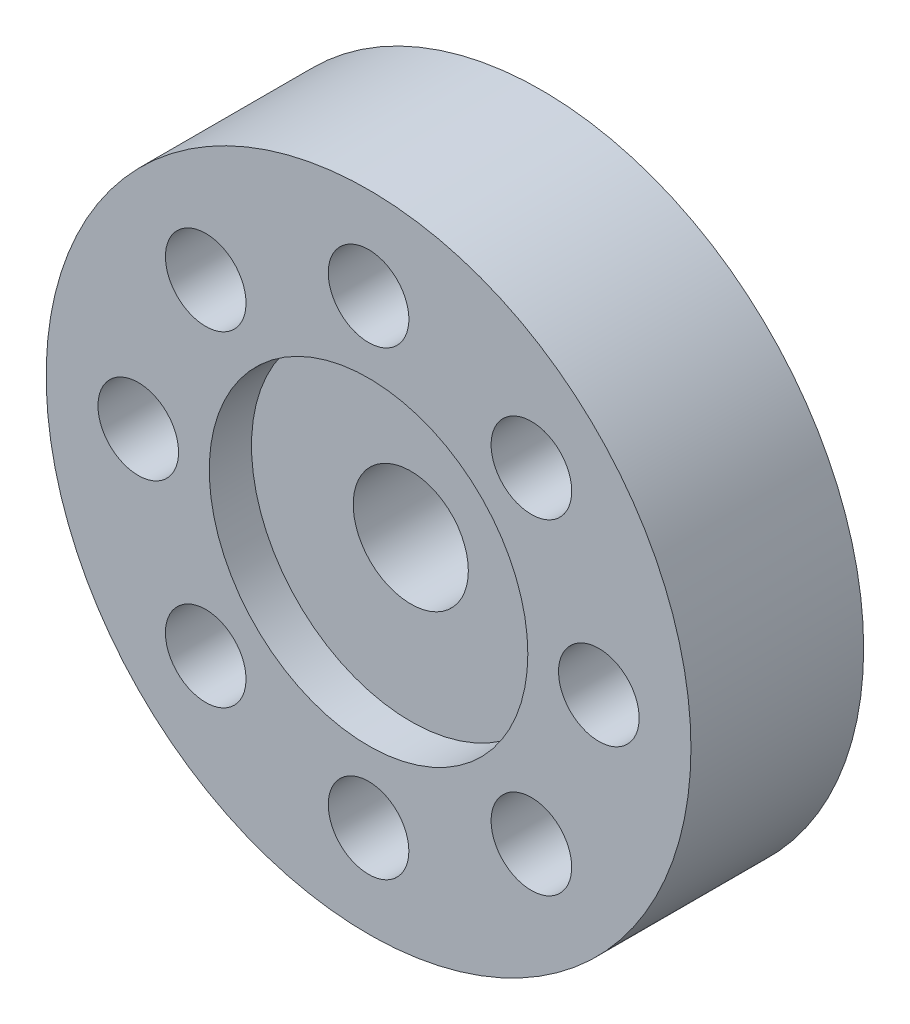
ISO-10303-21;
HEADER;
FILE_DESCRIPTION(('STEP AP214'),'2;1');
FILE_NAME('part.step','',(''),(''),'','','');
FILE_SCHEMA(('AUTOMOTIVE_DESIGN { 1 0 10303 214 1 1 1 1 }'));
ENDSEC;
DATA;
#1=APPLICATION_CONTEXT('core data for automotive mechanical design processes');
#2=APPLICATION_PROTOCOL_DEFINITION('international standard','automotive_design',2000,#1);
#3=PRODUCT_CONTEXT('',#1,'mechanical');
#4=PRODUCT('Part','Part','',(#3));
#5=PRODUCT_RELATED_PRODUCT_CATEGORY('part','',(#4));
#6=PRODUCT_DEFINITION_FORMATION('','',#4);
#7=PRODUCT_DEFINITION_CONTEXT('part definition',#1,'design');
#8=PRODUCT_DEFINITION('design','',#6,#7);
#9=PRODUCT_DEFINITION_SHAPE('','',#8);
#10=(LENGTH_UNIT() NAMED_UNIT(*) SI_UNIT(.MILLI.,.METRE.));
#11=(NAMED_UNIT(*) PLANE_ANGLE_UNIT() SI_UNIT($,.RADIAN.));
#12=(NAMED_UNIT(*) SI_UNIT($,.STERADIAN.) SOLID_ANGLE_UNIT());
#13=UNCERTAINTY_MEASURE_WITH_UNIT(LENGTH_MEASURE(1.E-05),#10,'distance_accuracy_value','');
#14=(GEOMETRIC_REPRESENTATION_CONTEXT(3) GLOBAL_UNCERTAINTY_ASSIGNED_CONTEXT((#13)) GLOBAL_UNIT_ASSIGNED_CONTEXT((#10,
#11,#12)) REPRESENTATION_CONTEXT('',''));
#15=CARTESIAN_POINT('',(0.,0.,0.));
#16=DIRECTION('',(0.,0.,1.));
#17=DIRECTION('',(1.,0.,0.));
#18=AXIS2_PLACEMENT_3D('',#15,#16,#17);
#19=CARTESIAN_POINT('',(0.,0.,0.));
#20=DIRECTION('',(0.,0.,1.));
#21=DIRECTION('',(1.,0.,0.));
#22=AXIS2_PLACEMENT_3D('',#19,#20,#21);
#23=PLANE('',#22);
#24=CARTESIAN_POINT('',(0.,0.,0.));
#25=DIRECTION('',(0.,0.,1.));
#26=DIRECTION('',(1.,0.,0.));
#27=AXIS2_PLACEMENT_3D('',#24,#25,#26);
#28=CIRCLE('',#27,3.9);
#29=CARTESIAN_POINT('',(3.9,0.,0.));
#30=VERTEX_POINT('',#29);
#31=EDGE_CURVE('E62',#30,#30,#28,.T.);
#32=ORIENTED_EDGE('',*,*,#31,.F.);
#33=EDGE_LOOP('',(#32));
#34=FACE_BOUND('',#33,.T.);
#35=CARTESIAN_POINT('',(0.,0.,0.));
#36=DIRECTION('',(0.,0.,1.));
#37=DIRECTION('',(1.,0.,0.));
#38=AXIS2_PLACEMENT_3D('',#35,#36,#37);
#39=CIRCLE('',#38,1.5);
#40=CARTESIAN_POINT('',(1.5,0.,0.));
#41=VERTEX_POINT('',#40);
#42=EDGE_CURVE('E10',#41,#41,#39,.T.);
#43=ORIENTED_EDGE('',*,*,#42,.T.);
#44=EDGE_LOOP('',(#43));
#45=FACE_BOUND('',#44,.T.);
#46=ADVANCED_FACE('F34',(#34,#45),#23,.F.);
#47=CARTESIAN_POINT('',(0.,0.,4.2));
#48=DIRECTION('',(0.,0.,1.));
#49=DIRECTION('',(1.,0.,0.));
#50=AXIS2_PLACEMENT_3D('',#47,#48,#49);
#51=CYLINDRICAL_SURFACE('',#50,1.5);
#52=CARTESIAN_POINT('',(0.,0.,4.2));
#53=DIRECTION('',(0.,0.,1.));
#54=DIRECTION('',(1.,0.,0.));
#55=AXIS2_PLACEMENT_3D('',#52,#53,#54);
#56=CIRCLE('',#55,1.5);
#57=CARTESIAN_POINT('',(1.5,0.,4.2));
#58=VERTEX_POINT('',#57);
#59=EDGE_CURVE('E40',#58,#58,#56,.T.);
#60=ORIENTED_EDGE('',*,*,#59,.T.);
#61=EDGE_LOOP('',(#60));
#62=FACE_BOUND('',#61,.T.);
#63=ORIENTED_EDGE('',*,*,#42,.F.);
#64=EDGE_LOOP('',(#63));
#65=FACE_BOUND('',#64,.T.);
#66=ADVANCED_FACE('F149',(#62,#65),#51,.F.);
#67=CARTESIAN_POINT('',(0.,0.,4.2));
#68=DIRECTION('',(0.,0.,-1.));
#69=DIRECTION('',(-1.,0.,0.));
#70=AXIS2_PLACEMENT_3D('',#67,#68,#69);
#71=PLANE('',#70);
#72=ORIENTED_EDGE('',*,*,#59,.F.);
#73=EDGE_LOOP('',(#72));
#74=FACE_BOUND('',#73,.T.);
#75=CARTESIAN_POINT('',(0.,0.,4.2));
#76=DIRECTION('',(0.,0.,1.));
#77=DIRECTION('',(1.,0.,0.));
#78=AXIS2_PLACEMENT_3D('',#75,#76,#77);
#79=CIRCLE('',#78,4.15);
#80=CARTESIAN_POINT('',(4.15,0.,4.2));
#81=VERTEX_POINT('',#80);
#82=EDGE_CURVE('E44',#81,#81,#79,.T.);
#83=ORIENTED_EDGE('',*,*,#82,.T.);
#84=EDGE_LOOP('',(#83));
#85=FACE_BOUND('',#84,.T.);
#86=ADVANCED_FACE('F153',(#74,#85),#71,.F.);
#87=CARTESIAN_POINT('',(0.,0.,4.2));
#88=DIRECTION('',(0.,0.,1.));
#89=DIRECTION('',(1.,0.,0.));
#90=AXIS2_PLACEMENT_3D('',#87,#88,#89);
#91=CYLINDRICAL_SURFACE('',#90,4.15);
#92=ORIENTED_EDGE('',*,*,#82,.F.);
#93=EDGE_LOOP('',(#92));
#94=FACE_BOUND('',#93,.T.);
#95=CARTESIAN_POINT('',(0.,0.,5.3));
#96=DIRECTION('',(0.,0.,1.));
#97=DIRECTION('',(1.,0.,0.));
#98=AXIS2_PLACEMENT_3D('',#95,#96,#97);
#99=CIRCLE('',#98,4.15);
#100=CARTESIAN_POINT('',(4.15,0.,5.3));
#101=VERTEX_POINT('',#100);
#102=EDGE_CURVE('E48',#101,#101,#99,.T.);
#103=ORIENTED_EDGE('',*,*,#102,.T.);
#104=EDGE_LOOP('',(#103));
#105=FACE_BOUND('',#104,.T.);
#106=ADVANCED_FACE('F157',(#94,#105),#91,.F.);
#107=CARTESIAN_POINT('',(0.,0.,5.3));
#108=DIRECTION('',(0.,0.,-1.));
#109=DIRECTION('',(-1.,0.,0.));
#110=AXIS2_PLACEMENT_3D('',#107,#108,#109);
#111=PLANE('',#110);
#112=CARTESIAN_POINT('',(6.,0.,5.3));
#113=DIRECTION('',(0.,0.,-1.));
#114=DIRECTION('',(0.,1.,0.));
#115=AXIS2_PLACEMENT_3D('',#112,#113,#114);
#116=CIRCLE('',#115,1.05);
#117=CARTESIAN_POINT('',(6.,1.04999999999998,5.3));
#118=VERTEX_POINT('',#117);
#119=EDGE_CURVE('E75',#118,#118,#116,.T.);
#120=ORIENTED_EDGE('',*,*,#119,.T.);
#121=EDGE_LOOP('',(#120));
#122=FACE_BOUND('',#121,.T.);
#123=CARTESIAN_POINT('',(4.24264068711926,-4.24264068711931,5.3));
#124=DIRECTION('',(0.,0.,-1.));
#125=DIRECTION('',(0.707106781186551,0.707106781186544,0.));
#126=AXIS2_PLACEMENT_3D('',#123,#124,#125);
#127=CIRCLE('',#126,1.05);
#128=CARTESIAN_POINT('',(4.98510280736514,-3.50017856687344,5.3));
#129=VERTEX_POINT('',#128);
#130=EDGE_CURVE('E94',#129,#129,#127,.T.);
#131=ORIENTED_EDGE('',*,*,#130,.T.);
#132=EDGE_LOOP('',(#131));
#133=FACE_BOUND('',#132,.T.);
#134=CARTESIAN_POINT('',(0.,-6.,5.3));
#135=DIRECTION('',(0.,0.,-1.));
#136=DIRECTION('',(1.,0.,0.));
#137=AXIS2_PLACEMENT_3D('',#134,#135,#136);
#138=CIRCLE('',#137,1.05);
#139=CARTESIAN_POINT('',(1.05,-6.,5.3));
#140=VERTEX_POINT('',#139);
#141=EDGE_CURVE('E88',#140,#140,#138,.T.);
#142=ORIENTED_EDGE('',*,*,#141,.T.);
#143=EDGE_LOOP('',(#142));
#144=FACE_BOUND('',#143,.T.);
#145=CARTESIAN_POINT('',(-4.24264068711932,-4.24264068711925,5.3));
#146=DIRECTION('',(0.,0.,-1.));
#147=DIRECTION('',(0.707106781186541,-0.707106781186554,0.));
#148=AXIS2_PLACEMENT_3D('',#145,#146,#147);
#149=CIRCLE('',#148,1.05);
#150=CARTESIAN_POINT('',(-3.50017856687345,-4.98510280736513,5.3));
#151=VERTEX_POINT('',#150);
#152=EDGE_CURVE('E81',#151,#151,#149,.T.);
#153=ORIENTED_EDGE('',*,*,#152,.T.);
#154=EDGE_LOOP('',(#153));
#155=FACE_BOUND('',#154,.T.);
#156=CARTESIAN_POINT('',(-6.,0.,5.3));
#157=DIRECTION('',(0.,0.,-1.));
#158=DIRECTION('',(0.,-1.,0.));
#159=AXIS2_PLACEMENT_3D('',#156,#157,#158);
#160=CIRCLE('',#159,1.05);
#161=CARTESIAN_POINT('',(-6.00000000000001,-1.04999999999994,5.3));
#162=VERTEX_POINT('',#161);
#163=EDGE_CURVE('E82',#162,#162,#160,.T.);
#164=ORIENTED_EDGE('',*,*,#163,.T.);
#165=EDGE_LOOP('',(#164));
#166=FACE_BOUND('',#165,.T.);
#167=CARTESIAN_POINT('',(-4.24264068711923,4.24264068711934,5.3));
#168=DIRECTION('',(0.,0.,-1.));
#169=DIRECTION('',(-0.707106781186556,-0.707106781186539,0.));
#170=AXIS2_PLACEMENT_3D('',#167,#168,#169);
#171=CIRCLE('',#170,1.05);
#172=CARTESIAN_POINT('',(-4.98510280736512,3.50017856687347,5.3));
#173=VERTEX_POINT('',#172);
#174=EDGE_CURVE('E105',#173,#173,#171,.T.);
#175=ORIENTED_EDGE('',*,*,#174,.T.);
#176=EDGE_LOOP('',(#175));
#177=FACE_BOUND('',#176,.T.);
#178=CARTESIAN_POINT('',(4.24264068711929,4.24264068711928,5.3));
#179=DIRECTION('',(0.,0.,-1.));
#180=DIRECTION('',(-0.707106781186546,0.707106781186549,0.));
#181=AXIS2_PLACEMENT_3D('',#178,#179,#180);
#182=CIRCLE('',#181,1.05);
#183=CARTESIAN_POINT('',(3.50017856687342,4.98510280736515,5.3));
#184=VERTEX_POINT('',#183);
#185=EDGE_CURVE('E69',#184,#184,#182,.T.);
#186=ORIENTED_EDGE('',*,*,#185,.T.);
#187=EDGE_LOOP('',(#186));
#188=FACE_BOUND('',#187,.T.);
#189=CARTESIAN_POINT('',(0.,6.,5.3));
#190=DIRECTION('',(0.,0.,-1.));
#191=DIRECTION('',(-1.,0.,0.));
#192=AXIS2_PLACEMENT_3D('',#189,#190,#191);
#193=CIRCLE('',#192,1.05);
#194=CARTESIAN_POINT('',(-1.05,6.,5.3));
#195=VERTEX_POINT('',#194);
#196=EDGE_CURVE('E65',#195,#195,#193,.T.);
#197=ORIENTED_EDGE('',*,*,#196,.T.);
#198=EDGE_LOOP('',(#197));
#199=FACE_BOUND('',#198,.T.);
#200=ORIENTED_EDGE('',*,*,#102,.F.);
#201=EDGE_LOOP('',(#200));
#202=FACE_BOUND('',#201,.T.);
#203=CARTESIAN_POINT('',(0.,0.,5.3));
#204=DIRECTION('',(0.,0.,1.));
#205=DIRECTION('',(1.,0.,0.));
#206=AXIS2_PLACEMENT_3D('',#203,#204,#205);
#207=CIRCLE('',#206,8.4);
#208=CARTESIAN_POINT('',(8.4,0.,5.3));
#209=VERTEX_POINT('',#208);
#210=EDGE_CURVE('E53',#209,#209,#207,.T.);
#211=ORIENTED_EDGE('',*,*,#210,.T.);
#212=EDGE_LOOP('',(#211));
#213=FACE_BOUND('',#212,.T.);
#214=ADVANCED_FACE('F114',(#122,#133,#144,#155,#166,#177,#188,#199,#202,#213),#111,.F.);
#215=CARTESIAN_POINT('',(0.,0.,4.2));
#216=DIRECTION('',(0.,0.,1.));
#217=DIRECTION('',(1.,0.,0.));
#218=AXIS2_PLACEMENT_3D('',#215,#216,#217);
#219=CYLINDRICAL_SURFACE('',#218,8.4);
#220=ORIENTED_EDGE('',*,*,#210,.F.);
#221=EDGE_LOOP('',(#220));
#222=FACE_BOUND('',#221,.T.);
#223=CARTESIAN_POINT('',(0.,0.,0.8));
#224=DIRECTION('',(0.,0.,1.));
#225=DIRECTION('',(1.,0.,0.));
#226=AXIS2_PLACEMENT_3D('',#223,#224,#225);
#227=CIRCLE('',#226,8.4);
#228=CARTESIAN_POINT('',(8.4,0.,0.8));
#229=VERTEX_POINT('',#228);
#230=EDGE_CURVE('E56',#229,#229,#227,.T.);
#231=ORIENTED_EDGE('',*,*,#230,.T.);
#232=EDGE_LOOP('',(#231));
#233=FACE_BOUND('',#232,.T.);
#234=ADVANCED_FACE('F129',(#222,#233),#219,.T.);
#235=CARTESIAN_POINT('',(0.,0.,0.8));
#236=DIRECTION('',(0.,0.,1.));
#237=DIRECTION('',(1.,0.,0.));
#238=AXIS2_PLACEMENT_3D('',#235,#236,#237);
#239=PLANE('',#238);
#240=CARTESIAN_POINT('',(6.,0.,0.8));
#241=DIRECTION('',(0.,0.,-1.));
#242=DIRECTION('',(0.,1.,0.));
#243=AXIS2_PLACEMENT_3D('',#240,#241,#242);
#244=CIRCLE('',#243,1.05);
#245=CARTESIAN_POINT('',(6.,1.04999999999998,0.8));
#246=VERTEX_POINT('',#245);
#247=EDGE_CURVE('E97',#246,#246,#244,.T.);
#248=ORIENTED_EDGE('',*,*,#247,.F.);
#249=EDGE_LOOP('',(#248));
#250=FACE_BOUND('',#249,.T.);
#251=CARTESIAN_POINT('',(4.24264068711926,-4.24264068711931,0.8));
#252=DIRECTION('',(0.,0.,-1.));
#253=DIRECTION('',(0.707106781186551,0.707106781186544,0.));
#254=AXIS2_PLACEMENT_3D('',#251,#252,#253);
#255=CIRCLE('',#254,1.05);
#256=CARTESIAN_POINT('',(4.98510280736514,-3.50017856687344,0.8));
#257=VERTEX_POINT('',#256);
#258=EDGE_CURVE('E91',#257,#257,#255,.T.);
#259=ORIENTED_EDGE('',*,*,#258,.F.);
#260=EDGE_LOOP('',(#259));
#261=FACE_BOUND('',#260,.T.);
#262=CARTESIAN_POINT('',(0.,-6.,0.8));
#263=DIRECTION('',(0.,0.,-1.));
#264=DIRECTION('',(1.,0.,0.));
#265=AXIS2_PLACEMENT_3D('',#262,#263,#264);
#266=CIRCLE('',#265,1.05);
#267=CARTESIAN_POINT('',(1.05,-6.,0.8));
#268=VERTEX_POINT('',#267);
#269=EDGE_CURVE('E85',#268,#268,#266,.T.);
#270=ORIENTED_EDGE('',*,*,#269,.F.);
#271=EDGE_LOOP('',(#270));
#272=FACE_BOUND('',#271,.T.);
#273=CARTESIAN_POINT('',(-4.24264068711932,-4.24264068711925,0.8));
#274=DIRECTION('',(0.,0.,-1.));
#275=DIRECTION('',(0.707106781186541,-0.707106781186554,0.));
#276=AXIS2_PLACEMENT_3D('',#273,#274,#275);
#277=CIRCLE('',#276,1.05);
#278=CARTESIAN_POINT('',(-3.50017856687345,-4.98510280736513,0.8));
#279=VERTEX_POINT('',#278);
#280=EDGE_CURVE('E78',#279,#279,#277,.T.);
#281=ORIENTED_EDGE('',*,*,#280,.F.);
#282=EDGE_LOOP('',(#281));
#283=FACE_BOUND('',#282,.T.);
#284=CARTESIAN_POINT('',(-6.,0.,0.8));
#285=DIRECTION('',(0.,0.,-1.));
#286=DIRECTION('',(0.,-1.,0.));
#287=AXIS2_PLACEMENT_3D('',#284,#285,#286);
#288=CIRCLE('',#287,1.05);
#289=CARTESIAN_POINT('',(-6.00000000000001,-1.04999999999994,0.8));
#290=VERTEX_POINT('',#289);
#291=EDGE_CURVE('E108',#290,#290,#288,.T.);
#292=ORIENTED_EDGE('',*,*,#291,.F.);
#293=EDGE_LOOP('',(#292));
#294=FACE_BOUND('',#293,.T.);
#295=CARTESIAN_POINT('',(-4.24264068711923,4.24264068711934,0.8));
#296=DIRECTION('',(0.,0.,-1.));
#297=DIRECTION('',(-0.707106781186556,-0.707106781186539,0.));
#298=AXIS2_PLACEMENT_3D('',#295,#296,#297);
#299=CIRCLE('',#298,1.05);
#300=CARTESIAN_POINT('',(-4.98510280736512,3.50017856687347,0.8));
#301=VERTEX_POINT('',#300);
#302=EDGE_CURVE('E102',#301,#301,#299,.T.);
#303=ORIENTED_EDGE('',*,*,#302,.F.);
#304=EDGE_LOOP('',(#303));
#305=FACE_BOUND('',#304,.T.);
#306=CARTESIAN_POINT('',(4.24264068711929,4.24264068711928,0.8));
#307=DIRECTION('',(0.,0.,-1.));
#308=DIRECTION('',(-0.707106781186546,0.707106781186549,0.));
#309=AXIS2_PLACEMENT_3D('',#306,#307,#308);
#310=CIRCLE('',#309,1.05);
#311=CARTESIAN_POINT('',(3.50017856687342,4.98510280736515,0.8));
#312=VERTEX_POINT('',#311);
#313=EDGE_CURVE('E72',#312,#312,#310,.T.);
#314=ORIENTED_EDGE('',*,*,#313,.F.);
#315=EDGE_LOOP('',(#314));
#316=FACE_BOUND('',#315,.T.);
#317=CARTESIAN_POINT('',(0.,6.,0.8));
#318=DIRECTION('',(0.,0.,-1.));
#319=DIRECTION('',(-1.,0.,0.));
#320=AXIS2_PLACEMENT_3D('',#317,#318,#319);
#321=CIRCLE('',#320,1.05);
#322=CARTESIAN_POINT('',(-1.05,6.,0.8));
#323=VERTEX_POINT('',#322);
#324=EDGE_CURVE('E66',#323,#323,#321,.T.);
#325=ORIENTED_EDGE('',*,*,#324,.F.);
#326=EDGE_LOOP('',(#325));
#327=FACE_BOUND('',#326,.T.);
#328=ORIENTED_EDGE('',*,*,#230,.F.);
#329=EDGE_LOOP('',(#328));
#330=FACE_BOUND('',#329,.T.);
#331=CARTESIAN_POINT('',(0.,0.,0.8));
#332=DIRECTION('',(0.,0.,1.));
#333=DIRECTION('',(1.,0.,0.));
#334=AXIS2_PLACEMENT_3D('',#331,#332,#333);
#335=CIRCLE('',#334,3.9);
#336=CARTESIAN_POINT('',(3.9,0.,0.8));
#337=VERTEX_POINT('',#336);
#338=EDGE_CURVE('E59',#337,#337,#335,.T.);
#339=ORIENTED_EDGE('',*,*,#338,.T.);
#340=EDGE_LOOP('',(#339));
#341=FACE_BOUND('',#340,.T.);
#342=ADVANCED_FACE('F125',(#250,#261,#272,#283,#294,#305,#316,#327,#330,#341),#239,.F.);
#343=CARTESIAN_POINT('',(0.,0.,4.2));
#344=DIRECTION('',(0.,0.,1.));
#345=DIRECTION('',(1.,0.,0.));
#346=AXIS2_PLACEMENT_3D('',#343,#344,#345);
#347=CYLINDRICAL_SURFACE('',#346,3.9);
#348=ORIENTED_EDGE('',*,*,#338,.F.);
#349=EDGE_LOOP('',(#348));
#350=FACE_BOUND('',#349,.T.);
#351=ORIENTED_EDGE('',*,*,#31,.T.);
#352=EDGE_LOOP('',(#351));
#353=FACE_BOUND('',#352,.T.);
#354=ADVANCED_FACE('F128',(#350,#353),#347,.T.);
#355=CARTESIAN_POINT('',(0.,6.,5.3));
#356=DIRECTION('',(0.,0.,-1.));
#357=DIRECTION('',(-1.,0.,0.));
#358=AXIS2_PLACEMENT_3D('',#355,#356,#357);
#359=CYLINDRICAL_SURFACE('',#358,1.05);
#360=ORIENTED_EDGE('',*,*,#196,.F.);
#361=EDGE_LOOP('',(#360));
#362=FACE_BOUND('',#361,.T.);
#363=ORIENTED_EDGE('',*,*,#324,.T.);
#364=EDGE_LOOP('',(#363));
#365=FACE_BOUND('',#364,.T.);
#366=ADVANCED_FACE('F144',(#362,#365),#359,.F.);
#367=CARTESIAN_POINT('',(4.24264068711929,4.24264068711928,5.3));
#368=DIRECTION('',(0.,0.,-1.));
#369=DIRECTION('',(-1.,0.,0.));
#370=AXIS2_PLACEMENT_3D('',#367,#368,#369);
#371=CYLINDRICAL_SURFACE('',#370,1.05);
#372=ORIENTED_EDGE('',*,*,#185,.F.);
#373=EDGE_LOOP('',(#372));
#374=FACE_BOUND('',#373,.T.);
#375=ORIENTED_EDGE('',*,*,#313,.T.);
#376=EDGE_LOOP('',(#375));
#377=FACE_BOUND('',#376,.T.);
#378=ADVANCED_FACE('F173',(#374,#377),#371,.F.);
#379=CARTESIAN_POINT('',(-4.24264068711923,4.24264068711934,5.3));
#380=DIRECTION('',(0.,0.,-1.));
#381=DIRECTION('',(-1.,0.,0.));
#382=AXIS2_PLACEMENT_3D('',#379,#380,#381);
#383=CYLINDRICAL_SURFACE('',#382,1.05);
#384=ORIENTED_EDGE('',*,*,#174,.F.);
#385=EDGE_LOOP('',(#384));
#386=FACE_BOUND('',#385,.T.);
#387=ORIENTED_EDGE('',*,*,#302,.T.);
#388=EDGE_LOOP('',(#387));
#389=FACE_BOUND('',#388,.T.);
#390=ADVANCED_FACE('F121',(#386,#389),#383,.F.);
#391=CARTESIAN_POINT('',(-6.,0.,5.3));
#392=DIRECTION('',(0.,0.,-1.));
#393=DIRECTION('',(-1.,0.,0.));
#394=AXIS2_PLACEMENT_3D('',#391,#392,#393);
#395=CYLINDRICAL_SURFACE('',#394,1.05);
#396=ORIENTED_EDGE('',*,*,#163,.F.);
#397=EDGE_LOOP('',(#396));
#398=FACE_BOUND('',#397,.T.);
#399=ORIENTED_EDGE('',*,*,#291,.T.);
#400=EDGE_LOOP('',(#399));
#401=FACE_BOUND('',#400,.T.);
#402=ADVANCED_FACE('F117',(#398,#401),#395,.F.);
#403=CARTESIAN_POINT('',(-4.24264068711932,-4.24264068711925,5.3));
#404=DIRECTION('',(0.,0.,-1.));
#405=DIRECTION('',(-1.,0.,0.));
#406=AXIS2_PLACEMENT_3D('',#403,#404,#405);
#407=CYLINDRICAL_SURFACE('',#406,1.05);
#408=ORIENTED_EDGE('',*,*,#152,.F.);
#409=EDGE_LOOP('',(#408));
#410=FACE_BOUND('',#409,.T.);
#411=ORIENTED_EDGE('',*,*,#280,.T.);
#412=EDGE_LOOP('',(#411));
#413=FACE_BOUND('',#412,.T.);
#414=ADVANCED_FACE('F120',(#410,#413),#407,.F.);
#415=CARTESIAN_POINT('',(0.,-6.,5.3));
#416=DIRECTION('',(0.,0.,-1.));
#417=DIRECTION('',(-1.,0.,0.));
#418=AXIS2_PLACEMENT_3D('',#415,#416,#417);
#419=CYLINDRICAL_SURFACE('',#418,1.05);
#420=ORIENTED_EDGE('',*,*,#141,.F.);
#421=EDGE_LOOP('',(#420));
#422=FACE_BOUND('',#421,.T.);
#423=ORIENTED_EDGE('',*,*,#269,.T.);
#424=EDGE_LOOP('',(#423));
#425=FACE_BOUND('',#424,.T.);
#426=ADVANCED_FACE('F180',(#422,#425),#419,.F.);
#427=CARTESIAN_POINT('',(4.24264068711926,-4.24264068711931,5.3));
#428=DIRECTION('',(0.,0.,-1.));
#429=DIRECTION('',(-1.,0.,0.));
#430=AXIS2_PLACEMENT_3D('',#427,#428,#429);
#431=CYLINDRICAL_SURFACE('',#430,1.05);
#432=ORIENTED_EDGE('',*,*,#130,.F.);
#433=EDGE_LOOP('',(#432));
#434=FACE_BOUND('',#433,.T.);
#435=ORIENTED_EDGE('',*,*,#258,.T.);
#436=EDGE_LOOP('',(#435));
#437=FACE_BOUND('',#436,.T.);
#438=ADVANCED_FACE('F184',(#434,#437),#431,.F.);
#439=CARTESIAN_POINT('',(6.,0.,5.3));
#440=DIRECTION('',(0.,0.,-1.));
#441=DIRECTION('',(-1.,0.,0.));
#442=AXIS2_PLACEMENT_3D('',#439,#440,#441);
#443=CYLINDRICAL_SURFACE('',#442,1.05);
#444=ORIENTED_EDGE('',*,*,#119,.F.);
#445=EDGE_LOOP('',(#444));
#446=FACE_BOUND('',#445,.T.);
#447=ORIENTED_EDGE('',*,*,#247,.T.);
#448=EDGE_LOOP('',(#447));
#449=FACE_BOUND('',#448,.T.);
#450=ADVANCED_FACE('F188',(#446,#449),#443,.F.);
#451=CLOSED_SHELL('',(#46,#66,#86,#106,#214,#234,#342,#354,#366,#378,#390,#402,#414,#426,#438,#450));
#452=MANIFOLD_SOLID_BREP('B2',#451);
#453=ADVANCED_BREP_SHAPE_REPRESENTATION('',(#18,#452),#14);
#454=SHAPE_DEFINITION_REPRESENTATION(#9,#453);
ENDSEC;
END-ISO-10303-21;
